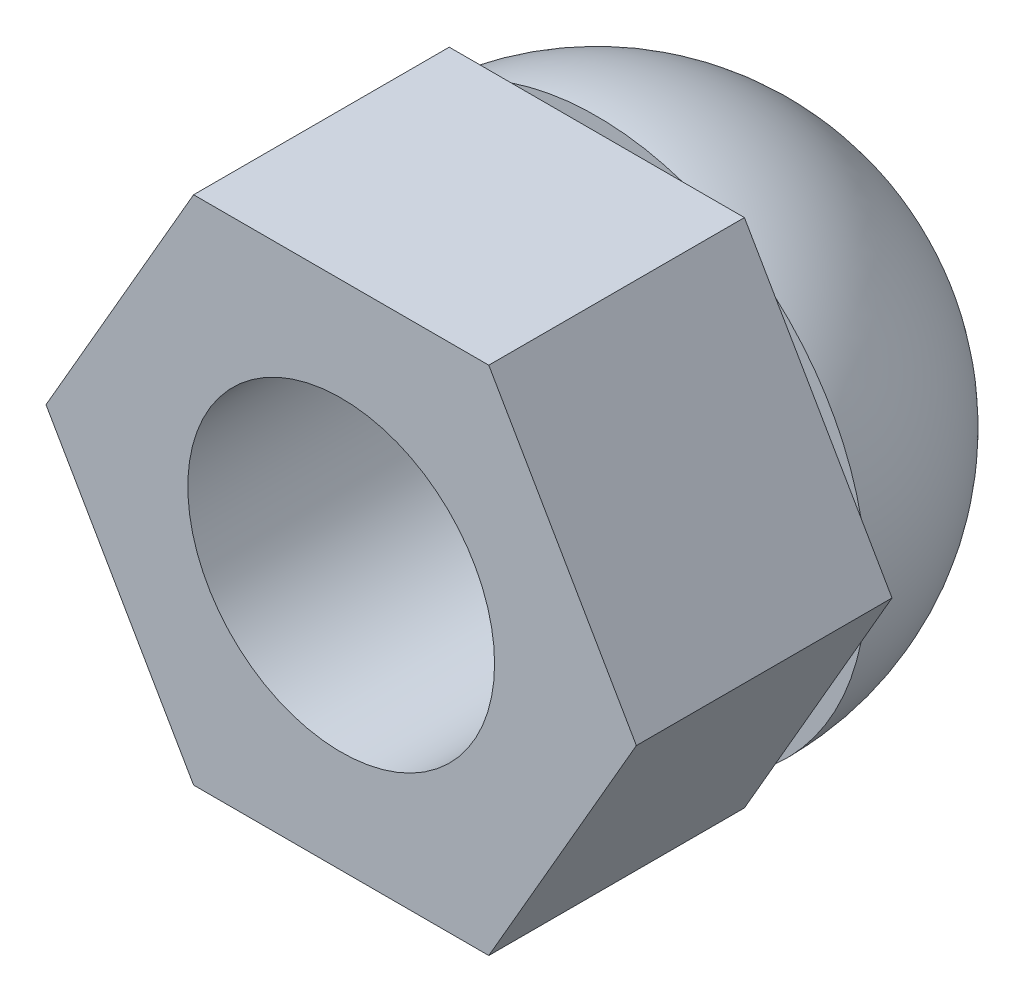
ISO-10303-21;
HEADER;
FILE_DESCRIPTION(('STEP AP214'),'2;1');
FILE_NAME('part.step','',(''),(''),'','','');
FILE_SCHEMA(('AUTOMOTIVE_DESIGN { 1 0 10303 214 1 1 1 1 }'));
ENDSEC;
DATA;
#1=APPLICATION_CONTEXT('core data for automotive mechanical design processes');
#2=APPLICATION_PROTOCOL_DEFINITION('international standard','automotive_design',2000,#1);
#3=PRODUCT_CONTEXT('',#1,'mechanical');
#4=PRODUCT('Part','Part','',(#3));
#5=PRODUCT_RELATED_PRODUCT_CATEGORY('part','',(#4));
#6=PRODUCT_DEFINITION_FORMATION('','',#4);
#7=PRODUCT_DEFINITION_CONTEXT('part definition',#1,'design');
#8=PRODUCT_DEFINITION('design','',#6,#7);
#9=PRODUCT_DEFINITION_SHAPE('','',#8);
#10=(LENGTH_UNIT() NAMED_UNIT(*) SI_UNIT(.MILLI.,.METRE.));
#11=(NAMED_UNIT(*) PLANE_ANGLE_UNIT() SI_UNIT($,.RADIAN.));
#12=(NAMED_UNIT(*) SI_UNIT($,.STERADIAN.) SOLID_ANGLE_UNIT());
#13=UNCERTAINTY_MEASURE_WITH_UNIT(LENGTH_MEASURE(1.E-05),#10,'distance_accuracy_value','');
#14=(GEOMETRIC_REPRESENTATION_CONTEXT(3) GLOBAL_UNCERTAINTY_ASSIGNED_CONTEXT((#13)) GLOBAL_UNIT_ASSIGNED_CONTEXT((#10,
#11,#12)) REPRESENTATION_CONTEXT('',''));
#15=CARTESIAN_POINT('',(0.,0.,0.));
#16=DIRECTION('',(0.,0.,1.));
#17=DIRECTION('',(1.,0.,0.));
#18=AXIS2_PLACEMENT_3D('',#15,#16,#17);
#19=CARTESIAN_POINT('',(0.,0.,0.));
#20=DIRECTION('',(0.,0.,1.));
#21=DIRECTION('',(1.,0.,0.));
#22=AXIS2_PLACEMENT_3D('',#19,#20,#21);
#23=PLANE('',#22);
#24=CARTESIAN_POINT('',(0.,0.,0.));
#25=DIRECTION('',(0.,0.,-1.));
#26=DIRECTION('',(-1.,0.,0.));
#27=AXIS2_PLACEMENT_3D('',#24,#25,#26);
#28=CIRCLE('',#27,5.27350269189626);
#29=CARTESIAN_POINT('',(3.49199954630287,-3.95167936579597,0.));
#30=VERTEX_POINT('',#29);
#31=CARTESIAN_POINT('',(1.67625494523867,-5.,0.));
#32=VERTEX_POINT('',#31);
#33=EDGE_CURVE('E224',#30,#32,#28,.T.);
#34=ORIENTED_EDGE('',*,*,#33,.F.);
#35=DIRECTION('',(0.5,0.866025403784439,0.));
#36=VECTOR('',#35,1.);
#37=CARTESIAN_POINT('',(2.88675134594813,-5.,0.));
#38=LINE('',#37,#36);
#39=CARTESIAN_POINT('',(2.88675134594813,-5.,0.));
#40=VERTEX_POINT('',#39);
#41=EDGE_CURVE('E151',#40,#30,#38,.T.);
#42=ORIENTED_EDGE('',*,*,#41,.F.);
#43=DIRECTION('',(1.,0.,0.));
#44=VECTOR('',#43,1.);
#45=CARTESIAN_POINT('',(-2.88675134594813,-5.,0.));
#46=LINE('',#45,#44);
#47=EDGE_CURVE('E148',#32,#40,#46,.T.);
#48=ORIENTED_EDGE('',*,*,#47,.F.);
#49=EDGE_LOOP('',(#34,#42,#48));
#50=FACE_BOUND('',#49,.T.);
#51=ADVANCED_FACE('F33',(#50),#23,.F.);
#52=CARTESIAN_POINT('',(-1.67625494523866,-5.,0.));
#53=VERTEX_POINT('',#52);
#54=CARTESIAN_POINT('',(-3.49199954630286,-3.95167936579598,0.));
#55=VERTEX_POINT('',#54);
#56=EDGE_CURVE('E232',#53,#55,#28,.T.);
#57=ORIENTED_EDGE('',*,*,#56,.F.);
#58=CARTESIAN_POINT('',(-2.88675134594813,-5.,0.));
#59=VERTEX_POINT('',#58);
#60=EDGE_CURVE('E149',#59,#53,#46,.T.);
#61=ORIENTED_EDGE('',*,*,#60,.F.);
#62=DIRECTION('',(0.5,-0.866025403784438,0.));
#63=VECTOR('',#62,1.);
#64=CARTESIAN_POINT('',(-5.77350269189626,0.,0.));
#65=LINE('',#64,#63);
#66=EDGE_CURVE('E120',#55,#59,#65,.T.);
#67=ORIENTED_EDGE('',*,*,#66,.F.);
#68=EDGE_LOOP('',(#57,#61,#67));
#69=FACE_BOUND('',#68,.T.);
#70=ADVANCED_FACE('F276',(#69),#23,.F.);
#71=CARTESIAN_POINT('',(-5.16825449154152,-1.04832063420402,0.));
#72=VERTEX_POINT('',#71);
#73=CARTESIAN_POINT('',(-5.16825449154153,1.04832063420402,0.));
#74=VERTEX_POINT('',#73);
#75=EDGE_CURVE('E180',#72,#74,#28,.T.);
#76=ORIENTED_EDGE('',*,*,#75,.F.);
#77=CARTESIAN_POINT('',(-5.77350269189626,0.,0.));
#78=VERTEX_POINT('',#77);
#79=EDGE_CURVE('E146',#78,#72,#65,.T.);
#80=ORIENTED_EDGE('',*,*,#79,.F.);
#81=DIRECTION('',(-0.5,-0.866025403784439,0.));
#82=VECTOR('',#81,1.);
#83=CARTESIAN_POINT('',(-2.88675134594813,5.,0.));
#84=LINE('',#83,#82);
#85=EDGE_CURVE('E142',#74,#78,#84,.T.);
#86=ORIENTED_EDGE('',*,*,#85,.F.);
#87=EDGE_LOOP('',(#76,#80,#86));
#88=FACE_BOUND('',#87,.T.);
#89=ADVANCED_FACE('F251',(#88),#23,.F.);
#90=CARTESIAN_POINT('',(-3.49199954630286,3.95167936579597,0.));
#91=VERTEX_POINT('',#90);
#92=CARTESIAN_POINT('',(-1.67625494523867,5.,0.));
#93=VERTEX_POINT('',#92);
#94=EDGE_CURVE('E170',#91,#93,#28,.T.);
#95=ORIENTED_EDGE('',*,*,#94,.F.);
#96=CARTESIAN_POINT('',(-2.88675134594813,5.,0.));
#97=VERTEX_POINT('',#96);
#98=EDGE_CURVE('E143',#97,#91,#84,.T.);
#99=ORIENTED_EDGE('',*,*,#98,.F.);
#100=DIRECTION('',(-1.,0.,0.));
#101=VECTOR('',#100,1.);
#102=CARTESIAN_POINT('',(2.88675134594813,5.,0.));
#103=LINE('',#102,#101);
#104=EDGE_CURVE('E137',#93,#97,#103,.T.);
#105=ORIENTED_EDGE('',*,*,#104,.F.);
#106=EDGE_LOOP('',(#95,#99,#105));
#107=FACE_BOUND('',#106,.T.);
#108=ADVANCED_FACE('F166',(#107),#23,.F.);
#109=CARTESIAN_POINT('',(1.67625494523867,5.,0.));
#110=VERTEX_POINT('',#109);
#111=CARTESIAN_POINT('',(3.49199954630286,3.95167936579598,0.));
#112=VERTEX_POINT('',#111);
#113=EDGE_CURVE('E181',#110,#112,#28,.T.);
#114=ORIENTED_EDGE('',*,*,#113,.F.);
#115=CARTESIAN_POINT('',(2.88675134594813,5.,0.));
#116=VERTEX_POINT('',#115);
#117=EDGE_CURVE('E139',#116,#110,#103,.T.);
#118=ORIENTED_EDGE('',*,*,#117,.F.);
#119=DIRECTION('',(-0.500000000000001,0.866025403784438,0.));
#120=VECTOR('',#119,1.);
#121=CARTESIAN_POINT('',(5.77350269189626,0.,0.));
#122=LINE('',#121,#120);
#123=EDGE_CURVE('E138',#112,#116,#122,.T.);
#124=ORIENTED_EDGE('',*,*,#123,.F.);
#125=EDGE_LOOP('',(#114,#118,#124));
#126=FACE_BOUND('',#125,.T.);
#127=ADVANCED_FACE('F218',(#126),#23,.F.);
#128=CARTESIAN_POINT('',(0.,0.,5.));
#129=DIRECTION('',(0.,0.,1.));
#130=DIRECTION('',(1.,0.,0.));
#131=AXIS2_PLACEMENT_3D('',#128,#129,#130);
#132=PLANE('',#131);
#133=DIRECTION('',(-0.500000000000001,0.866025403784438,0.));
#134=VECTOR('',#133,1.);
#135=CARTESIAN_POINT('',(5.77350269189626,0.,5.));
#136=LINE('',#135,#134);
#137=CARTESIAN_POINT('',(5.77350269189626,0.,5.));
#138=VERTEX_POINT('',#137);
#139=CARTESIAN_POINT('',(2.88675134594813,5.,5.));
#140=VERTEX_POINT('',#139);
#141=EDGE_CURVE('E154',#138,#140,#136,.T.);
#142=ORIENTED_EDGE('',*,*,#141,.T.);
#143=DIRECTION('',(-1.,0.,0.));
#144=VECTOR('',#143,1.);
#145=CARTESIAN_POINT('',(2.88675134594813,5.,5.));
#146=LINE('',#145,#144);
#147=CARTESIAN_POINT('',(-2.88675134594813,5.,5.));
#148=VERTEX_POINT('',#147);
#149=EDGE_CURVE('E92',#140,#148,#146,.T.);
#150=ORIENTED_EDGE('',*,*,#149,.T.);
#151=DIRECTION('',(-0.5,-0.866025403784439,0.));
#152=VECTOR('',#151,1.);
#153=CARTESIAN_POINT('',(-2.88675134594813,5.,5.));
#154=LINE('',#153,#152);
#155=CARTESIAN_POINT('',(-5.77350269189626,0.,5.));
#156=VERTEX_POINT('',#155);
#157=EDGE_CURVE('E109',#148,#156,#154,.T.);
#158=ORIENTED_EDGE('',*,*,#157,.T.);
#159=DIRECTION('',(0.5,-0.866025403784438,0.));
#160=VECTOR('',#159,1.);
#161=CARTESIAN_POINT('',(-5.77350269189626,0.,5.));
#162=LINE('',#161,#160);
#163=CARTESIAN_POINT('',(-2.88675134594813,-5.,5.));
#164=VERTEX_POINT('',#163);
#165=EDGE_CURVE('E101',#156,#164,#162,.T.);
#166=ORIENTED_EDGE('',*,*,#165,.T.);
#167=DIRECTION('',(1.,0.,0.));
#168=VECTOR('',#167,1.);
#169=CARTESIAN_POINT('',(-2.88675134594813,-5.,5.));
#170=LINE('',#169,#168);
#171=CARTESIAN_POINT('',(2.88675134594813,-5.,5.));
#172=VERTEX_POINT('',#171);
#173=EDGE_CURVE('E106',#164,#172,#170,.T.);
#174=ORIENTED_EDGE('',*,*,#173,.T.);
#175=DIRECTION('',(0.5,0.866025403784439,0.));
#176=VECTOR('',#175,1.);
#177=CARTESIAN_POINT('',(2.88675134594813,-5.,5.));
#178=LINE('',#177,#176);
#179=EDGE_CURVE('E57',#172,#138,#178,.T.);
#180=ORIENTED_EDGE('',*,*,#179,.T.);
#181=EDGE_LOOP('',(#142,#150,#158,#166,#174,#180));
#182=FACE_BOUND('',#181,.T.);
#183=CARTESIAN_POINT('',(0.,0.,5.));
#184=DIRECTION('',(0.,0.,1.));
#185=DIRECTION('',(1.,0.,0.));
#186=AXIS2_PLACEMENT_3D('',#183,#184,#185);
#187=CIRCLE('',#186,3.);
#188=CARTESIAN_POINT('',(3.,0.,5.));
#189=VERTEX_POINT('',#188);
#190=EDGE_CURVE('E200',#189,#189,#187,.T.);
#191=ORIENTED_EDGE('',*,*,#190,.F.);
#192=EDGE_LOOP('',(#191));
#193=FACE_BOUND('',#192,.T.);
#194=ADVANCED_FACE('F103',(#182,#193),#132,.T.);
#195=CARTESIAN_POINT('',(5.16825449154152,1.04832063420403,0.));
#196=VERTEX_POINT('',#195);
#197=CARTESIAN_POINT('',(5.16825449154153,-1.04832063420403,0.));
#198=VERTEX_POINT('',#197);
#199=EDGE_CURVE('E48',#196,#198,#28,.T.);
#200=ORIENTED_EDGE('',*,*,#199,.F.);
#201=CARTESIAN_POINT('',(5.77350269189626,0.,0.));
#202=VERTEX_POINT('',#201);
#203=EDGE_CURVE('E134',#202,#196,#122,.T.);
#204=ORIENTED_EDGE('',*,*,#203,.F.);
#205=EDGE_CURVE('E84',#198,#202,#38,.T.);
#206=ORIENTED_EDGE('',*,*,#205,.F.);
#207=EDGE_LOOP('',(#200,#204,#206));
#208=FACE_BOUND('',#207,.T.);
#209=ADVANCED_FACE('F279',(#208),#23,.F.);
#210=CARTESIAN_POINT('',(5.77350269189626,0.,5.));
#211=DIRECTION('',(-0.866025403784438,-0.500000000000001,0.));
#212=DIRECTION('',(0.500000000000001,-0.866025403784438,0.));
#213=AXIS2_PLACEMENT_3D('',#210,#211,#212);
#214=PLANE('',#213);
#215=ORIENTED_EDGE('',*,*,#203,.T.);
#216=DIRECTION('',(0.500000000000001,-0.866025403784438,0.));
#217=VECTOR('',#216,1.);
#218=CARTESIAN_POINT('',(5.77350269189626,0.,0.));
#219=LINE('',#218,#217);
#220=EDGE_CURVE('E196',#112,#196,#219,.T.);
#221=ORIENTED_EDGE('',*,*,#220,.F.);
#222=ORIENTED_EDGE('',*,*,#123,.T.);
#223=DIRECTION('',(0.,0.,-1.));
#224=VECTOR('',#223,1.);
#225=CARTESIAN_POINT('',(2.88675134594813,5.,5.));
#226=LINE('',#225,#224);
#227=EDGE_CURVE('E11',#140,#116,#226,.T.);
#228=ORIENTED_EDGE('',*,*,#227,.F.);
#229=ORIENTED_EDGE('',*,*,#141,.F.);
#230=DIRECTION('',(0.,0.,-1.));
#231=VECTOR('',#230,1.);
#232=CARTESIAN_POINT('',(5.77350269189626,0.,5.));
#233=LINE('',#232,#231);
#234=EDGE_CURVE('E130',#138,#202,#233,.T.);
#235=ORIENTED_EDGE('',*,*,#234,.T.);
#236=EDGE_LOOP('',(#215,#221,#222,#228,#229,#235));
#237=FACE_BOUND('',#236,.T.);
#238=ADVANCED_FACE('F35',(#237),#214,.F.);
#239=CARTESIAN_POINT('',(2.88675134594813,5.,5.));
#240=DIRECTION('',(0.,-1.,0.));
#241=DIRECTION('',(1.,0.,0.));
#242=AXIS2_PLACEMENT_3D('',#239,#240,#241);
#243=PLANE('',#242);
#244=ORIENTED_EDGE('',*,*,#117,.T.);
#245=DIRECTION('',(1.,0.,0.));
#246=VECTOR('',#245,1.);
#247=CARTESIAN_POINT('',(2.88675134594813,5.,0.));
#248=LINE('',#247,#246);
#249=EDGE_CURVE('E193',#93,#110,#248,.T.);
#250=ORIENTED_EDGE('',*,*,#249,.F.);
#251=ORIENTED_EDGE('',*,*,#104,.T.);
#252=DIRECTION('',(0.,0.,-1.));
#253=VECTOR('',#252,1.);
#254=CARTESIAN_POINT('',(-2.88675134594813,5.,5.));
#255=LINE('',#254,#253);
#256=EDGE_CURVE('E41',#148,#97,#255,.T.);
#257=ORIENTED_EDGE('',*,*,#256,.F.);
#258=ORIENTED_EDGE('',*,*,#149,.F.);
#259=ORIENTED_EDGE('',*,*,#227,.T.);
#260=EDGE_LOOP('',(#244,#250,#251,#257,#258,#259));
#261=FACE_BOUND('',#260,.T.);
#262=ADVANCED_FACE('F212',(#261),#243,.F.);
#263=CARTESIAN_POINT('',(-2.88675134594813,5.,5.));
#264=DIRECTION('',(0.866025403784439,-0.5,0.));
#265=DIRECTION('',(0.5,0.866025403784439,0.));
#266=AXIS2_PLACEMENT_3D('',#263,#264,#265);
#267=PLANE('',#266);
#268=ORIENTED_EDGE('',*,*,#98,.T.);
#269=DIRECTION('',(0.5,0.866025403784439,0.));
#270=VECTOR('',#269,1.);
#271=CARTESIAN_POINT('',(-2.88675134594813,5.,0.));
#272=LINE('',#271,#270);
#273=EDGE_CURVE('E191',#74,#91,#272,.T.);
#274=ORIENTED_EDGE('',*,*,#273,.F.);
#275=ORIENTED_EDGE('',*,*,#85,.T.);
#276=DIRECTION('',(0.,0.,-1.));
#277=VECTOR('',#276,1.);
#278=CARTESIAN_POINT('',(-5.77350269189626,0.,5.));
#279=LINE('',#278,#277);
#280=EDGE_CURVE('E124',#156,#78,#279,.T.);
#281=ORIENTED_EDGE('',*,*,#280,.F.);
#282=ORIENTED_EDGE('',*,*,#157,.F.);
#283=ORIENTED_EDGE('',*,*,#256,.T.);
#284=EDGE_LOOP('',(#268,#274,#275,#281,#282,#283));
#285=FACE_BOUND('',#284,.T.);
#286=ADVANCED_FACE('F160',(#285),#267,.F.);
#287=CARTESIAN_POINT('',(-5.77350269189626,0.,5.));
#288=DIRECTION('',(0.866025403784439,0.5,0.));
#289=DIRECTION('',(-0.5,0.866025403784439,0.));
#290=AXIS2_PLACEMENT_3D('',#287,#288,#289);
#291=PLANE('',#290);
#292=ORIENTED_EDGE('',*,*,#79,.T.);
#293=DIRECTION('',(-0.5,0.866025403784439,0.));
#294=VECTOR('',#293,1.);
#295=CARTESIAN_POINT('',(-5.77350269189626,0.,0.));
#296=LINE('',#295,#294);
#297=EDGE_CURVE('E188',#55,#72,#296,.T.);
#298=ORIENTED_EDGE('',*,*,#297,.F.);
#299=ORIENTED_EDGE('',*,*,#66,.T.);
#300=DIRECTION('',(0.,0.,-1.));
#301=VECTOR('',#300,1.);
#302=CARTESIAN_POINT('',(-2.88675134594813,-5.,5.));
#303=LINE('',#302,#301);
#304=EDGE_CURVE('E115',#164,#59,#303,.T.);
#305=ORIENTED_EDGE('',*,*,#304,.F.);
#306=ORIENTED_EDGE('',*,*,#165,.F.);
#307=ORIENTED_EDGE('',*,*,#280,.T.);
#308=EDGE_LOOP('',(#292,#298,#299,#305,#306,#307));
#309=FACE_BOUND('',#308,.T.);
#310=ADVANCED_FACE('F117',(#309),#291,.F.);
#311=CARTESIAN_POINT('',(-2.88675134594813,-5.,5.));
#312=DIRECTION('',(0.,1.,0.));
#313=DIRECTION('',(-1.,0.,0.));
#314=AXIS2_PLACEMENT_3D('',#311,#312,#313);
#315=PLANE('',#314);
#316=ORIENTED_EDGE('',*,*,#60,.T.);
#317=DIRECTION('',(-1.,0.,0.));
#318=VECTOR('',#317,1.);
#319=CARTESIAN_POINT('',(-2.88675134594813,-5.,0.));
#320=LINE('',#319,#318);
#321=EDGE_CURVE('E185',#32,#53,#320,.T.);
#322=ORIENTED_EDGE('',*,*,#321,.F.);
#323=ORIENTED_EDGE('',*,*,#47,.T.);
#324=DIRECTION('',(0.,0.,-1.));
#325=VECTOR('',#324,1.);
#326=CARTESIAN_POINT('',(2.88675134594813,-5.,5.));
#327=LINE('',#326,#325);
#328=EDGE_CURVE('E125',#172,#40,#327,.T.);
#329=ORIENTED_EDGE('',*,*,#328,.F.);
#330=ORIENTED_EDGE('',*,*,#173,.F.);
#331=ORIENTED_EDGE('',*,*,#304,.T.);
#332=EDGE_LOOP('',(#316,#322,#323,#329,#330,#331));
#333=FACE_BOUND('',#332,.T.);
#334=ADVANCED_FACE('F127',(#333),#315,.F.);
#335=CARTESIAN_POINT('',(2.88675134594813,-5.,5.));
#336=DIRECTION('',(-0.866025403784439,0.5,0.));
#337=DIRECTION('',(-0.5,-0.866025403784439,0.));
#338=AXIS2_PLACEMENT_3D('',#335,#336,#337);
#339=PLANE('',#338);
#340=ORIENTED_EDGE('',*,*,#41,.T.);
#341=DIRECTION('',(-0.5,-0.866025403784439,0.));
#342=VECTOR('',#341,1.);
#343=CARTESIAN_POINT('',(2.88675134594813,-5.,0.));
#344=LINE('',#343,#342);
#345=EDGE_CURVE('E179',#198,#30,#344,.T.);
#346=ORIENTED_EDGE('',*,*,#345,.F.);
#347=ORIENTED_EDGE('',*,*,#205,.T.);
#348=ORIENTED_EDGE('',*,*,#234,.F.);
#349=ORIENTED_EDGE('',*,*,#179,.F.);
#350=ORIENTED_EDGE('',*,*,#328,.T.);
#351=EDGE_LOOP('',(#340,#346,#347,#348,#349,#350));
#352=FACE_BOUND('',#351,.T.);
#353=ADVANCED_FACE('F373',(#352),#339,.F.);
#354=CARTESIAN_POINT('',(0.,0.,5.));
#355=DIRECTION('',(0.,0.,-1.));
#356=DIRECTION('',(-1.,0.,0.));
#357=AXIS2_PLACEMENT_3D('',#354,#355,#356);
#358=CYLINDRICAL_SURFACE('',#357,3.);
#359=ORIENTED_EDGE('',*,*,#190,.T.);
#360=EDGE_LOOP('',(#359));
#361=FACE_BOUND('',#360,.T.);
#362=CARTESIAN_POINT('',(0.,0.,0.));
#363=DIRECTION('',(0.,0.,1.));
#364=DIRECTION('',(1.,0.,0.));
#365=AXIS2_PLACEMENT_3D('',#362,#363,#364);
#366=CIRCLE('',#365,3.);
#367=CARTESIAN_POINT('',(3.,0.,0.));
#368=VERTEX_POINT('',#367);
#369=EDGE_CURVE('E199',#368,#368,#366,.T.);
#370=ORIENTED_EDGE('',*,*,#369,.F.);
#371=EDGE_LOOP('',(#370));
#372=FACE_BOUND('',#371,.T.);
#373=ADVANCED_FACE('F321',(#361,#372),#358,.F.);
#374=CARTESIAN_POINT('',(0.,0.,0.));
#375=DIRECTION('',(0.,0.,-1.));
#376=DIRECTION('',(-1.,0.,0.));
#377=AXIS2_PLACEMENT_3D('',#374,#375,#376);
#378=PLANE('',#377);
#379=ORIENTED_EDGE('',*,*,#369,.T.);
#380=EDGE_LOOP('',(#379));
#381=FACE_BOUND('',#380,.T.);
#382=ADVANCED_FACE('F270',(#381),#378,.F.);
#383=EDGE_CURVE('E220',#112,#196,#28,.T.);
#384=ORIENTED_EDGE('',*,*,#383,.F.);
#385=ORIENTED_EDGE('',*,*,#220,.T.);
#386=EDGE_LOOP('',(#384,#385));
#387=FACE_BOUND('',#386,.T.);
#388=ADVANCED_FACE('F263',(#387),#378,.F.);
#389=EDGE_CURVE('E177',#93,#110,#28,.T.);
#390=ORIENTED_EDGE('',*,*,#389,.F.);
#391=ORIENTED_EDGE('',*,*,#249,.T.);
#392=EDGE_LOOP('',(#390,#391));
#393=FACE_BOUND('',#392,.T.);
#394=ADVANCED_FACE('F261',(#393),#378,.F.);
#395=EDGE_CURVE('E176',#74,#91,#28,.T.);
#396=ORIENTED_EDGE('',*,*,#395,.F.);
#397=ORIENTED_EDGE('',*,*,#273,.T.);
#398=EDGE_LOOP('',(#396,#397));
#399=FACE_BOUND('',#398,.T.);
#400=ADVANCED_FACE('F250',(#399),#378,.F.);
#401=EDGE_CURVE('E237',#55,#72,#28,.T.);
#402=ORIENTED_EDGE('',*,*,#401,.F.);
#403=ORIENTED_EDGE('',*,*,#297,.T.);
#404=EDGE_LOOP('',(#402,#403));
#405=FACE_BOUND('',#404,.T.);
#406=ADVANCED_FACE('F269',(#405),#378,.F.);
#407=EDGE_CURVE('E228',#32,#53,#28,.T.);
#408=ORIENTED_EDGE('',*,*,#407,.F.);
#409=ORIENTED_EDGE('',*,*,#321,.T.);
#410=EDGE_LOOP('',(#408,#409));
#411=FACE_BOUND('',#410,.T.);
#412=ADVANCED_FACE('F323',(#411),#378,.F.);
#413=EDGE_CURVE('E223',#198,#30,#28,.T.);
#414=ORIENTED_EDGE('',*,*,#413,.F.);
#415=ORIENTED_EDGE('',*,*,#345,.T.);
#416=EDGE_LOOP('',(#414,#415));
#417=FACE_BOUND('',#416,.T.);
#418=ADVANCED_FACE('F272',(#417),#378,.F.);
#419=CARTESIAN_POINT('',(0.,0.,0.));
#420=DIRECTION('',(0.,0.,-1.));
#421=DIRECTION('',(1.,0.,0.));
#422=AXIS2_PLACEMENT_3D('',#419,#420,#421);
#423=SPHERICAL_SURFACE('',#422,5.27350269189626);
#424=ORIENTED_EDGE('',*,*,#395,.T.);
#425=ORIENTED_EDGE('',*,*,#94,.T.);
#426=ORIENTED_EDGE('',*,*,#389,.T.);
#427=ORIENTED_EDGE('',*,*,#113,.T.);
#428=ORIENTED_EDGE('',*,*,#383,.T.);
#429=ORIENTED_EDGE('',*,*,#199,.T.);
#430=ORIENTED_EDGE('',*,*,#413,.T.);
#431=ORIENTED_EDGE('',*,*,#33,.T.);
#432=ORIENTED_EDGE('',*,*,#407,.T.);
#433=ORIENTED_EDGE('',*,*,#56,.T.);
#434=ORIENTED_EDGE('',*,*,#401,.T.);
#435=ORIENTED_EDGE('',*,*,#75,.T.);
#436=EDGE_LOOP('',(#424,#425,#426,#427,#428,#429,#430,#431,#432,#433,#434,#435));
#437=FACE_BOUND('',#436,.T.);
#438=ADVANCED_FACE('F244',(#437),#423,.T.);
#439=CLOSED_SHELL('',(#51,#70,#89,#108,#127,#194,#209,#238,#262,#286,#310,#334,#353,#373,#382,
#388,#394,#400,#406,#412,#418,#438));
#440=MANIFOLD_SOLID_BREP('B2',#439);
#441=ADVANCED_BREP_SHAPE_REPRESENTATION('',(#18,#440),#14);
#442=SHAPE_DEFINITION_REPRESENTATION(#9,#441);
ENDSEC;
END-ISO-10303-21;
